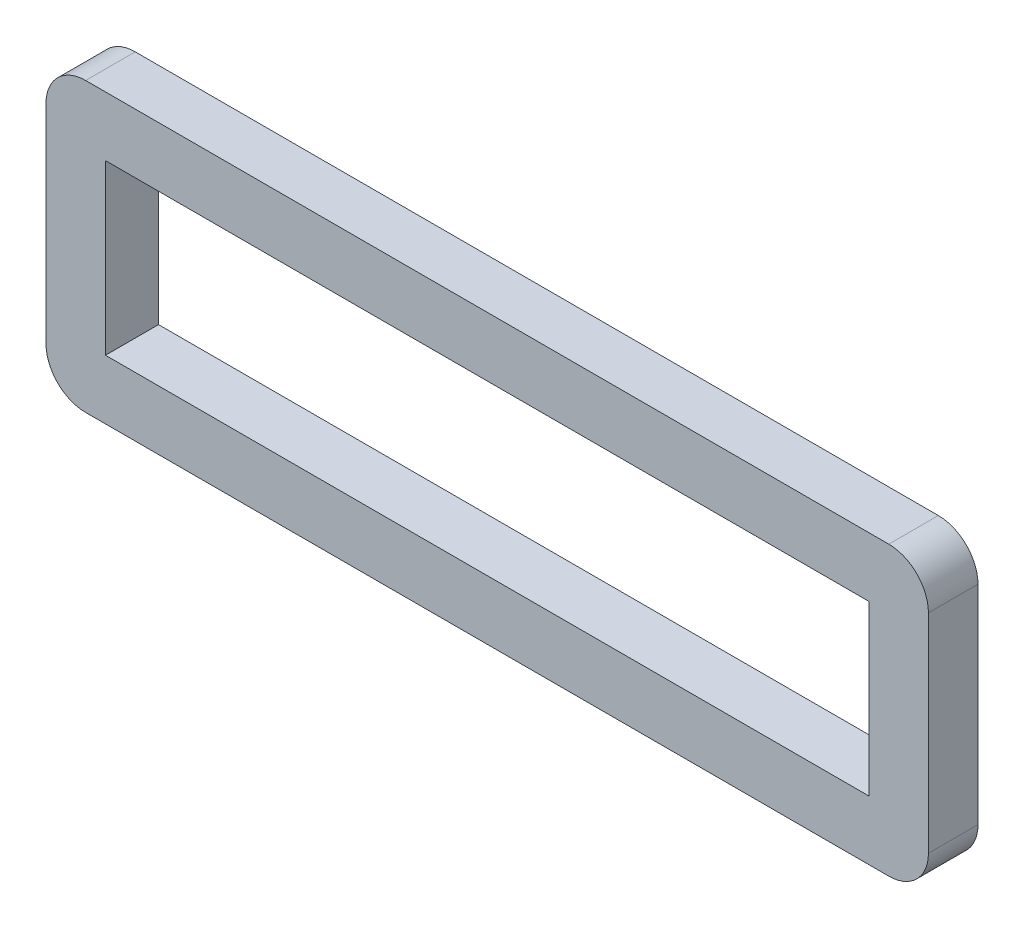
ISO-10303-21;
HEADER;
FILE_DESCRIPTION(('STEP AP214'),'2;1');
FILE_NAME('part.step','',(''),(''),'','','');
FILE_SCHEMA(('AUTOMOTIVE_DESIGN { 1 0 10303 214 1 1 1 1 }'));
ENDSEC;
DATA;
#1=APPLICATION_CONTEXT('core data for automotive mechanical design processes');
#2=APPLICATION_PROTOCOL_DEFINITION('international standard','automotive_design',2000,#1);
#3=PRODUCT_CONTEXT('',#1,'mechanical');
#4=PRODUCT('Part','Part','',(#3));
#5=PRODUCT_RELATED_PRODUCT_CATEGORY('part','',(#4));
#6=PRODUCT_DEFINITION_FORMATION('','',#4);
#7=PRODUCT_DEFINITION_CONTEXT('part definition',#1,'design');
#8=PRODUCT_DEFINITION('design','',#6,#7);
#9=PRODUCT_DEFINITION_SHAPE('','',#8);
#10=(LENGTH_UNIT() NAMED_UNIT(*) SI_UNIT(.MILLI.,.METRE.));
#11=(NAMED_UNIT(*) PLANE_ANGLE_UNIT() SI_UNIT($,.RADIAN.));
#12=(NAMED_UNIT(*) SI_UNIT($,.STERADIAN.) SOLID_ANGLE_UNIT());
#13=UNCERTAINTY_MEASURE_WITH_UNIT(LENGTH_MEASURE(1.E-05),#10,'distance_accuracy_value','');
#14=(GEOMETRIC_REPRESENTATION_CONTEXT(3) GLOBAL_UNCERTAINTY_ASSIGNED_CONTEXT((#13)) GLOBAL_UNIT_ASSIGNED_CONTEXT((#10,
#11,#12)) REPRESENTATION_CONTEXT('',''));
#15=CARTESIAN_POINT('',(0.,0.,0.));
#16=DIRECTION('',(0.,0.,1.));
#17=DIRECTION('',(1.,0.,0.));
#18=AXIS2_PLACEMENT_3D('',#15,#16,#17);
#19=CARTESIAN_POINT('',(0.,0.,5.));
#20=DIRECTION('',(0.,0.,1.));
#21=DIRECTION('',(1.,0.,0.));
#22=AXIS2_PLACEMENT_3D('',#19,#20,#21);
#23=PLANE('',#22);
#24=DIRECTION('',(1.,0.,0.));
#25=VECTOR('',#24,1.);
#26=CARTESIAN_POINT('',(-44.5,-14.5,5.));
#27=LINE('',#26,#25);
#28=CARTESIAN_POINT('',(-40.5,-14.5,5.));
#29=VERTEX_POINT('',#28);
#30=CARTESIAN_POINT('',(40.5,-14.5,5.));
#31=VERTEX_POINT('',#30);
#32=EDGE_CURVE('E200',#29,#31,#27,.T.);
#33=ORIENTED_EDGE('',*,*,#32,.T.);
#34=CARTESIAN_POINT('',(40.5,-10.5,5.));
#35=DIRECTION('',(0.,0.,1.));
#36=DIRECTION('',(1.,0.,0.));
#37=AXIS2_PLACEMENT_3D('',#34,#35,#36);
#38=CIRCLE('',#37,4.);
#39=CARTESIAN_POINT('',(44.5,-10.5,5.));
#40=VERTEX_POINT('',#39);
#41=EDGE_CURVE('E144',#31,#40,#38,.T.);
#42=ORIENTED_EDGE('',*,*,#41,.T.);
#43=DIRECTION('',(0.,1.,0.));
#44=VECTOR('',#43,1.);
#45=CARTESIAN_POINT('',(44.5,14.5,5.));
#46=LINE('',#45,#44);
#47=CARTESIAN_POINT('',(44.5,10.5,5.));
#48=VERTEX_POINT('',#47);
#49=EDGE_CURVE('E154',#40,#48,#46,.T.);
#50=ORIENTED_EDGE('',*,*,#49,.T.);
#51=CARTESIAN_POINT('',(40.5,10.5,5.));
#52=DIRECTION('',(0.,0.,1.));
#53=DIRECTION('',(1.,0.,0.));
#54=AXIS2_PLACEMENT_3D('',#51,#52,#53);
#55=CIRCLE('',#54,4.);
#56=CARTESIAN_POINT('',(40.5,14.5,5.));
#57=VERTEX_POINT('',#56);
#58=EDGE_CURVE('E152',#48,#57,#55,.T.);
#59=ORIENTED_EDGE('',*,*,#58,.T.);
#60=DIRECTION('',(-1.,0.,0.));
#61=VECTOR('',#60,1.);
#62=CARTESIAN_POINT('',(-44.5,14.5,5.));
#63=LINE('',#62,#61);
#64=CARTESIAN_POINT('',(-40.5,14.5,5.));
#65=VERTEX_POINT('',#64);
#66=EDGE_CURVE('E137',#57,#65,#63,.T.);
#67=ORIENTED_EDGE('',*,*,#66,.T.);
#68=CARTESIAN_POINT('',(-40.5,10.5,5.));
#69=DIRECTION('',(0.,0.,1.));
#70=DIRECTION('',(1.,0.,0.));
#71=AXIS2_PLACEMENT_3D('',#68,#69,#70);
#72=CIRCLE('',#71,4.);
#73=CARTESIAN_POINT('',(-44.5,10.5,5.));
#74=VERTEX_POINT('',#73);
#75=EDGE_CURVE('E149',#65,#74,#72,.T.);
#76=ORIENTED_EDGE('',*,*,#75,.T.);
#77=DIRECTION('',(0.,-1.,0.));
#78=VECTOR('',#77,1.);
#79=CARTESIAN_POINT('',(-44.5,14.5,5.));
#80=LINE('',#79,#78);
#81=CARTESIAN_POINT('',(-44.5,-10.5,5.));
#82=VERTEX_POINT('',#81);
#83=EDGE_CURVE('E153',#74,#82,#80,.T.);
#84=ORIENTED_EDGE('',*,*,#83,.T.);
#85=CARTESIAN_POINT('',(-40.5,-10.5,5.));
#86=DIRECTION('',(0.,0.,1.));
#87=DIRECTION('',(1.,0.,0.));
#88=AXIS2_PLACEMENT_3D('',#85,#86,#87);
#89=CIRCLE('',#88,4.);
#90=EDGE_CURVE('E159',#82,#29,#89,.T.);
#91=ORIENTED_EDGE('',*,*,#90,.T.);
#92=EDGE_LOOP('',(#33,#42,#50,#59,#67,#76,#84,#91));
#93=FACE_BOUND('',#92,.T.);
#94=DIRECTION('',(-1.,0.,0.));
#95=VECTOR('',#94,1.);
#96=CARTESIAN_POINT('',(-38.5,8.5,5.));
#97=LINE('',#96,#95);
#98=CARTESIAN_POINT('',(38.5,8.5,5.));
#99=VERTEX_POINT('',#98);
#100=CARTESIAN_POINT('',(-38.5,8.5,5.));
#101=VERTEX_POINT('',#100);
#102=EDGE_CURVE('E190',#99,#101,#97,.T.);
#103=ORIENTED_EDGE('',*,*,#102,.F.);
#104=DIRECTION('',(0.,1.,0.));
#105=VECTOR('',#104,1.);
#106=CARTESIAN_POINT('',(38.5,8.5,5.));
#107=LINE('',#106,#105);
#108=CARTESIAN_POINT('',(38.5,-8.5,5.));
#109=VERTEX_POINT('',#108);
#110=EDGE_CURVE('E80',#109,#99,#107,.T.);
#111=ORIENTED_EDGE('',*,*,#110,.F.);
#112=DIRECTION('',(1.,0.,0.));
#113=VECTOR('',#112,1.);
#114=CARTESIAN_POINT('',(-38.5,-8.5,5.));
#115=LINE('',#114,#113);
#116=CARTESIAN_POINT('',(-38.5,-8.5,5.));
#117=VERTEX_POINT('',#116);
#118=EDGE_CURVE('E174',#117,#109,#115,.T.);
#119=ORIENTED_EDGE('',*,*,#118,.F.);
#120=DIRECTION('',(0.,-1.,0.));
#121=VECTOR('',#120,1.);
#122=CARTESIAN_POINT('',(-38.5,8.5,5.));
#123=LINE('',#122,#121);
#124=EDGE_CURVE('E192',#101,#117,#123,.T.);
#125=ORIENTED_EDGE('',*,*,#124,.F.);
#126=EDGE_LOOP('',(#103,#111,#119,#125));
#127=FACE_BOUND('',#126,.T.);
#128=ADVANCED_FACE('F35',(#93,#127),#23,.T.);
#129=CARTESIAN_POINT('',(0.,0.,0.));
#130=DIRECTION('',(0.,0.,1.));
#131=DIRECTION('',(1.,0.,0.));
#132=AXIS2_PLACEMENT_3D('',#129,#130,#131);
#133=PLANE('',#132);
#134=DIRECTION('',(0.,1.,0.));
#135=VECTOR('',#134,1.);
#136=CARTESIAN_POINT('',(44.5,14.5,0.));
#137=LINE('',#136,#135);
#138=CARTESIAN_POINT('',(44.5,-10.5,0.));
#139=VERTEX_POINT('',#138);
#140=CARTESIAN_POINT('',(44.5,10.5,0.));
#141=VERTEX_POINT('',#140);
#142=EDGE_CURVE('E177',#139,#141,#137,.T.);
#143=ORIENTED_EDGE('',*,*,#142,.F.);
#144=CARTESIAN_POINT('',(40.5,-10.5,0.));
#145=DIRECTION('',(0.,0.,1.));
#146=DIRECTION('',(1.,0.,0.));
#147=AXIS2_PLACEMENT_3D('',#144,#145,#146);
#148=CIRCLE('',#147,4.);
#149=CARTESIAN_POINT('',(40.5,-14.5,0.));
#150=VERTEX_POINT('',#149);
#151=EDGE_CURVE('E220',#139,#150,#148,.F.);
#152=ORIENTED_EDGE('',*,*,#151,.T.);
#153=DIRECTION('',(1.,0.,0.));
#154=VECTOR('',#153,1.);
#155=CARTESIAN_POINT('',(-44.5,-14.5,0.));
#156=LINE('',#155,#154);
#157=CARTESIAN_POINT('',(-40.5,-14.5,0.));
#158=VERTEX_POINT('',#157);
#159=EDGE_CURVE('E197',#158,#150,#156,.T.);
#160=ORIENTED_EDGE('',*,*,#159,.F.);
#161=CARTESIAN_POINT('',(-40.5,-10.5,0.));
#162=DIRECTION('',(0.,0.,1.));
#163=DIRECTION('',(1.,0.,0.));
#164=AXIS2_PLACEMENT_3D('',#161,#162,#163);
#165=CIRCLE('',#164,4.);
#166=CARTESIAN_POINT('',(-44.5,-10.5,0.));
#167=VERTEX_POINT('',#166);
#168=EDGE_CURVE('E216',#158,#167,#165,.F.);
#169=ORIENTED_EDGE('',*,*,#168,.T.);
#170=DIRECTION('',(0.,-1.,0.));
#171=VECTOR('',#170,1.);
#172=CARTESIAN_POINT('',(-44.5,14.5,0.));
#173=LINE('',#172,#171);
#174=CARTESIAN_POINT('',(-44.5,10.5,0.));
#175=VERTEX_POINT('',#174);
#176=EDGE_CURVE('E206',#175,#167,#173,.T.);
#177=ORIENTED_EDGE('',*,*,#176,.F.);
#178=CARTESIAN_POINT('',(-40.5,10.5,0.));
#179=DIRECTION('',(0.,0.,1.));
#180=DIRECTION('',(1.,0.,0.));
#181=AXIS2_PLACEMENT_3D('',#178,#179,#180);
#182=CIRCLE('',#181,4.);
#183=CARTESIAN_POINT('',(-40.5,14.5,0.));
#184=VERTEX_POINT('',#183);
#185=EDGE_CURVE('E214',#175,#184,#182,.F.);
#186=ORIENTED_EDGE('',*,*,#185,.T.);
#187=DIRECTION('',(-1.,0.,0.));
#188=VECTOR('',#187,1.);
#189=CARTESIAN_POINT('',(-44.5,14.5,0.));
#190=LINE('',#189,#188);
#191=CARTESIAN_POINT('',(40.5,14.5,0.));
#192=VERTEX_POINT('',#191);
#193=EDGE_CURVE('E140',#192,#184,#190,.T.);
#194=ORIENTED_EDGE('',*,*,#193,.F.);
#195=CARTESIAN_POINT('',(40.5,10.5,0.));
#196=DIRECTION('',(0.,0.,1.));
#197=DIRECTION('',(1.,0.,0.));
#198=AXIS2_PLACEMENT_3D('',#195,#196,#197);
#199=CIRCLE('',#198,4.);
#200=EDGE_CURVE('E218',#192,#141,#199,.F.);
#201=ORIENTED_EDGE('',*,*,#200,.T.);
#202=EDGE_LOOP('',(#143,#152,#160,#169,#177,#186,#194,#201));
#203=FACE_BOUND('',#202,.T.);
#204=DIRECTION('',(0.,1.,0.));
#205=VECTOR('',#204,1.);
#206=CARTESIAN_POINT('',(38.1503659402824,8.5,0.));
#207=LINE('',#206,#205);
#208=CARTESIAN_POINT('',(38.1503659402824,-8.15036594028245,0.));
#209=VERTEX_POINT('',#208);
#210=CARTESIAN_POINT('',(38.1503659402824,8.15036594028244,0.));
#211=VERTEX_POINT('',#210);
#212=EDGE_CURVE('E181',#209,#211,#207,.T.);
#213=ORIENTED_EDGE('',*,*,#212,.T.);
#214=DIRECTION('',(-1.,0.,0.));
#215=VECTOR('',#214,1.);
#216=CARTESIAN_POINT('',(-38.5,8.15036594028244,0.));
#217=LINE('',#216,#215);
#218=CARTESIAN_POINT('',(-38.1503659402824,8.15036594028244,0.));
#219=VERTEX_POINT('',#218);
#220=EDGE_CURVE('E184',#211,#219,#217,.T.);
#221=ORIENTED_EDGE('',*,*,#220,.T.);
#222=DIRECTION('',(0.,-1.,0.));
#223=VECTOR('',#222,1.);
#224=CARTESIAN_POINT('',(-38.1503659402824,8.5,0.));
#225=LINE('',#224,#223);
#226=CARTESIAN_POINT('',(-38.1503659402824,-8.15036594028245,0.));
#227=VERTEX_POINT('',#226);
#228=EDGE_CURVE('E186',#219,#227,#225,.T.);
#229=ORIENTED_EDGE('',*,*,#228,.T.);
#230=DIRECTION('',(1.,0.,0.));
#231=VECTOR('',#230,1.);
#232=CARTESIAN_POINT('',(-38.5,-8.15036594028245,0.));
#233=LINE('',#232,#231);
#234=EDGE_CURVE('E39',#227,#209,#233,.T.);
#235=ORIENTED_EDGE('',*,*,#234,.T.);
#236=EDGE_LOOP('',(#213,#221,#229,#235));
#237=FACE_BOUND('',#236,.T.);
#238=ADVANCED_FACE('F232',(#203,#237),#133,.F.);
#239=CARTESIAN_POINT('',(44.5,14.5,5.));
#240=DIRECTION('',(-1.,0.,0.));
#241=DIRECTION('',(0.,0.,1.));
#242=AXIS2_PLACEMENT_3D('',#239,#240,#241);
#243=PLANE('',#242);
#244=ORIENTED_EDGE('',*,*,#49,.F.);
#245=DIRECTION('',(0.,0.,-1.));
#246=VECTOR('',#245,1.);
#247=CARTESIAN_POINT('',(44.5,-10.5,5.));
#248=LINE('',#247,#246);
#249=EDGE_CURVE('E211',#40,#139,#248,.T.);
#250=ORIENTED_EDGE('',*,*,#249,.T.);
#251=ORIENTED_EDGE('',*,*,#142,.T.);
#252=DIRECTION('',(0.,0.,-1.));
#253=VECTOR('',#252,1.);
#254=CARTESIAN_POINT('',(44.5,10.5,5.));
#255=LINE('',#254,#253);
#256=EDGE_CURVE('E202',#141,#48,#255,.F.);
#257=ORIENTED_EDGE('',*,*,#256,.T.);
#258=EDGE_LOOP('',(#244,#250,#251,#257));
#259=FACE_BOUND('',#258,.T.);
#260=ADVANCED_FACE('F240',(#259),#243,.F.);
#261=CARTESIAN_POINT('',(-44.5,14.5,5.));
#262=DIRECTION('',(0.,-1.,0.));
#263=DIRECTION('',(0.,0.,-1.));
#264=AXIS2_PLACEMENT_3D('',#261,#262,#263);
#265=PLANE('',#264);
#266=ORIENTED_EDGE('',*,*,#66,.F.);
#267=DIRECTION('',(0.,0.,-1.));
#268=VECTOR('',#267,1.);
#269=CARTESIAN_POINT('',(40.5,14.5,5.));
#270=LINE('',#269,#268);
#271=EDGE_CURVE('E143',#57,#192,#270,.T.);
#272=ORIENTED_EDGE('',*,*,#271,.T.);
#273=ORIENTED_EDGE('',*,*,#193,.T.);
#274=DIRECTION('',(0.,0.,-1.));
#275=VECTOR('',#274,1.);
#276=CARTESIAN_POINT('',(-40.5,14.5,5.));
#277=LINE('',#276,#275);
#278=EDGE_CURVE('E133',#184,#65,#277,.F.);
#279=ORIENTED_EDGE('',*,*,#278,.T.);
#280=EDGE_LOOP('',(#266,#272,#273,#279));
#281=FACE_BOUND('',#280,.T.);
#282=ADVANCED_FACE('F135',(#281),#265,.F.);
#283=CARTESIAN_POINT('',(-44.5,14.5,5.));
#284=DIRECTION('',(1.,0.,0.));
#285=DIRECTION('',(0.,0.,-1.));
#286=AXIS2_PLACEMENT_3D('',#283,#284,#285);
#287=PLANE('',#286);
#288=ORIENTED_EDGE('',*,*,#176,.T.);
#289=DIRECTION('',(0.,0.,-1.));
#290=VECTOR('',#289,1.);
#291=CARTESIAN_POINT('',(-44.5,-10.5,5.));
#292=LINE('',#291,#290);
#293=EDGE_CURVE('E11',#167,#82,#292,.F.);
#294=ORIENTED_EDGE('',*,*,#293,.T.);
#295=ORIENTED_EDGE('',*,*,#83,.F.);
#296=DIRECTION('',(0.,0.,-1.));
#297=VECTOR('',#296,1.);
#298=CARTESIAN_POINT('',(-44.5,10.5,5.));
#299=LINE('',#298,#297);
#300=EDGE_CURVE('E45',#74,#175,#299,.T.);
#301=ORIENTED_EDGE('',*,*,#300,.T.);
#302=EDGE_LOOP('',(#288,#294,#295,#301));
#303=FACE_BOUND('',#302,.T.);
#304=ADVANCED_FACE('F244',(#303),#287,.F.);
#305=CARTESIAN_POINT('',(-44.5,-14.5,5.));
#306=DIRECTION('',(0.,1.,0.));
#307=DIRECTION('',(0.,0.,1.));
#308=AXIS2_PLACEMENT_3D('',#305,#306,#307);
#309=PLANE('',#308);
#310=ORIENTED_EDGE('',*,*,#159,.T.);
#311=DIRECTION('',(0.,0.,-1.));
#312=VECTOR('',#311,1.);
#313=CARTESIAN_POINT('',(40.5,-14.5,5.));
#314=LINE('',#313,#312);
#315=EDGE_CURVE('E160',#150,#31,#314,.F.);
#316=ORIENTED_EDGE('',*,*,#315,.T.);
#317=ORIENTED_EDGE('',*,*,#32,.F.);
#318=DIRECTION('',(0.,0.,-1.));
#319=VECTOR('',#318,1.);
#320=CARTESIAN_POINT('',(-40.5,-14.5,5.));
#321=LINE('',#320,#319);
#322=EDGE_CURVE('E163',#29,#158,#321,.T.);
#323=ORIENTED_EDGE('',*,*,#322,.T.);
#324=EDGE_LOOP('',(#310,#316,#317,#323));
#325=FACE_BOUND('',#324,.T.);
#326=ADVANCED_FACE('F226',(#325),#309,.F.);
#327=CARTESIAN_POINT('',(38.5,8.5,5.));
#328=DIRECTION('',(-0.997564050259824,0.,0.0697564737441255));
#329=DIRECTION('',(0.0697564737441255,0.,0.997564050259824));
#330=AXIS2_PLACEMENT_3D('',#327,#328,#329);
#331=PLANE('',#330);
#332=ORIENTED_EDGE('',*,*,#212,.F.);
#333=DIRECTION('',(-0.0695873743166648,0.0695873743166648,-0.995145815783508));
#334=VECTOR('',#333,1.);
#335=CARTESIAN_POINT('',(38.4176791547071,-8.41767915470711,3.82275706549597));
#336=LINE('',#335,#334);
#337=EDGE_CURVE('E171',#109,#209,#336,.T.);
#338=ORIENTED_EDGE('',*,*,#337,.F.);
#339=ORIENTED_EDGE('',*,*,#110,.T.);
#340=DIRECTION('',(-0.0695873743166648,-0.0695873743166648,-0.995145815783508));
#341=VECTOR('',#340,1.);
#342=CARTESIAN_POINT('',(38.1271349948499,8.12713499484985,-0.332217997459412));
#343=LINE('',#342,#341);
#344=EDGE_CURVE('E175',#99,#211,#343,.T.);
#345=ORIENTED_EDGE('',*,*,#344,.T.);
#346=EDGE_LOOP('',(#332,#338,#339,#345));
#347=FACE_BOUND('',#346,.T.);
#348=ADVANCED_FACE('F263',(#347),#331,.T.);
#349=CARTESIAN_POINT('',(-38.5,8.5,5.));
#350=DIRECTION('',(0.,-0.997564050259824,0.0697564737441255));
#351=DIRECTION('',(0.,-0.0697564737441255,-0.997564050259824));
#352=AXIS2_PLACEMENT_3D('',#349,#350,#351);
#353=PLANE('',#352);
#354=ORIENTED_EDGE('',*,*,#220,.F.);
#355=ORIENTED_EDGE('',*,*,#344,.F.);
#356=ORIENTED_EDGE('',*,*,#102,.T.);
#357=DIRECTION('',(0.0695873743166648,-0.0695873743166648,-0.995145815783508));
#358=VECTOR('',#357,1.);
#359=CARTESIAN_POINT('',(-38.5,8.5,5.));
#360=LINE('',#359,#358);
#361=EDGE_CURVE('E178',#101,#219,#360,.T.);
#362=ORIENTED_EDGE('',*,*,#361,.T.);
#363=EDGE_LOOP('',(#354,#355,#356,#362));
#364=FACE_BOUND('',#363,.T.);
#365=ADVANCED_FACE('F37',(#364),#353,.T.);
#366=CARTESIAN_POINT('',(-38.5,8.5,5.));
#367=DIRECTION('',(0.997564050259824,0.,0.0697564737441255));
#368=DIRECTION('',(0.0697564737441255,0.,-0.997564050259824));
#369=AXIS2_PLACEMENT_3D('',#366,#367,#368);
#370=PLANE('',#369);
#371=ORIENTED_EDGE('',*,*,#228,.F.);
#372=ORIENTED_EDGE('',*,*,#361,.F.);
#373=ORIENTED_EDGE('',*,*,#124,.T.);
#374=DIRECTION('',(0.0695873743166648,0.0695873743166648,-0.995145815783508));
#375=VECTOR('',#374,1.);
#376=CARTESIAN_POINT('',(-38.5,-8.5,5.));
#377=LINE('',#376,#375);
#378=EDGE_CURVE('E71',#117,#227,#377,.T.);
#379=ORIENTED_EDGE('',*,*,#378,.T.);
#380=EDGE_LOOP('',(#371,#372,#373,#379));
#381=FACE_BOUND('',#380,.T.);
#382=ADVANCED_FACE('F275',(#381),#370,.T.);
#383=CARTESIAN_POINT('',(-38.5,-8.5,5.));
#384=DIRECTION('',(0.,0.997564050259824,0.0697564737441255));
#385=DIRECTION('',(0.,-0.0697564737441255,0.997564050259824));
#386=AXIS2_PLACEMENT_3D('',#383,#384,#385);
#387=PLANE('',#386);
#388=ORIENTED_EDGE('',*,*,#234,.F.);
#389=ORIENTED_EDGE('',*,*,#378,.F.);
#390=ORIENTED_EDGE('',*,*,#118,.T.);
#391=ORIENTED_EDGE('',*,*,#337,.T.);
#392=EDGE_LOOP('',(#388,#389,#390,#391));
#393=FACE_BOUND('',#392,.T.);
#394=ADVANCED_FACE('F271',(#393),#387,.T.);
#395=CARTESIAN_POINT('',(40.5,-10.5,5.));
#396=DIRECTION('',(0.,0.,-1.));
#397=DIRECTION('',(-1.,0.,0.));
#398=AXIS2_PLACEMENT_3D('',#395,#396,#397);
#399=CYLINDRICAL_SURFACE('',#398,4.);
#400=ORIENTED_EDGE('',*,*,#41,.F.);
#401=ORIENTED_EDGE('',*,*,#315,.F.);
#402=ORIENTED_EDGE('',*,*,#151,.F.);
#403=ORIENTED_EDGE('',*,*,#249,.F.);
#404=EDGE_LOOP('',(#400,#401,#402,#403));
#405=FACE_BOUND('',#404,.T.);
#406=ADVANCED_FACE('F237',(#405),#399,.T.);
#407=CARTESIAN_POINT('',(40.5,10.5,5.));
#408=DIRECTION('',(0.,0.,-1.));
#409=DIRECTION('',(-1.,0.,0.));
#410=AXIS2_PLACEMENT_3D('',#407,#408,#409);
#411=CYLINDRICAL_SURFACE('',#410,4.);
#412=ORIENTED_EDGE('',*,*,#58,.F.);
#413=ORIENTED_EDGE('',*,*,#256,.F.);
#414=ORIENTED_EDGE('',*,*,#200,.F.);
#415=ORIENTED_EDGE('',*,*,#271,.F.);
#416=EDGE_LOOP('',(#412,#413,#414,#415));
#417=FACE_BOUND('',#416,.T.);
#418=ADVANCED_FACE('F243',(#417),#411,.T.);
#419=CARTESIAN_POINT('',(-40.5,-10.5,5.));
#420=DIRECTION('',(0.,0.,-1.));
#421=DIRECTION('',(-1.,0.,0.));
#422=AXIS2_PLACEMENT_3D('',#419,#420,#421);
#423=CYLINDRICAL_SURFACE('',#422,4.);
#424=ORIENTED_EDGE('',*,*,#90,.F.);
#425=ORIENTED_EDGE('',*,*,#293,.F.);
#426=ORIENTED_EDGE('',*,*,#168,.F.);
#427=ORIENTED_EDGE('',*,*,#322,.F.);
#428=EDGE_LOOP('',(#424,#425,#426,#427));
#429=FACE_BOUND('',#428,.T.);
#430=ADVANCED_FACE('F245',(#429),#423,.T.);
#431=CARTESIAN_POINT('',(-40.5,10.5,5.));
#432=DIRECTION('',(0.,0.,-1.));
#433=DIRECTION('',(-1.,0.,0.));
#434=AXIS2_PLACEMENT_3D('',#431,#432,#433);
#435=CYLINDRICAL_SURFACE('',#434,4.);
#436=ORIENTED_EDGE('',*,*,#75,.F.);
#437=ORIENTED_EDGE('',*,*,#278,.F.);
#438=ORIENTED_EDGE('',*,*,#185,.F.);
#439=ORIENTED_EDGE('',*,*,#300,.F.);
#440=EDGE_LOOP('',(#436,#437,#438,#439));
#441=FACE_BOUND('',#440,.T.);
#442=ADVANCED_FACE('F157',(#441),#435,.T.);
#443=CLOSED_SHELL('',(#128,#238,#260,#282,#304,#326,#348,#365,#382,#394,#406,#418,#430,#442));
#444=MANIFOLD_SOLID_BREP('B2',#443);
#445=ADVANCED_BREP_SHAPE_REPRESENTATION('',(#18,#444),#14);
#446=SHAPE_DEFINITION_REPRESENTATION(#9,#445);
ENDSEC;
END-ISO-10303-21;
